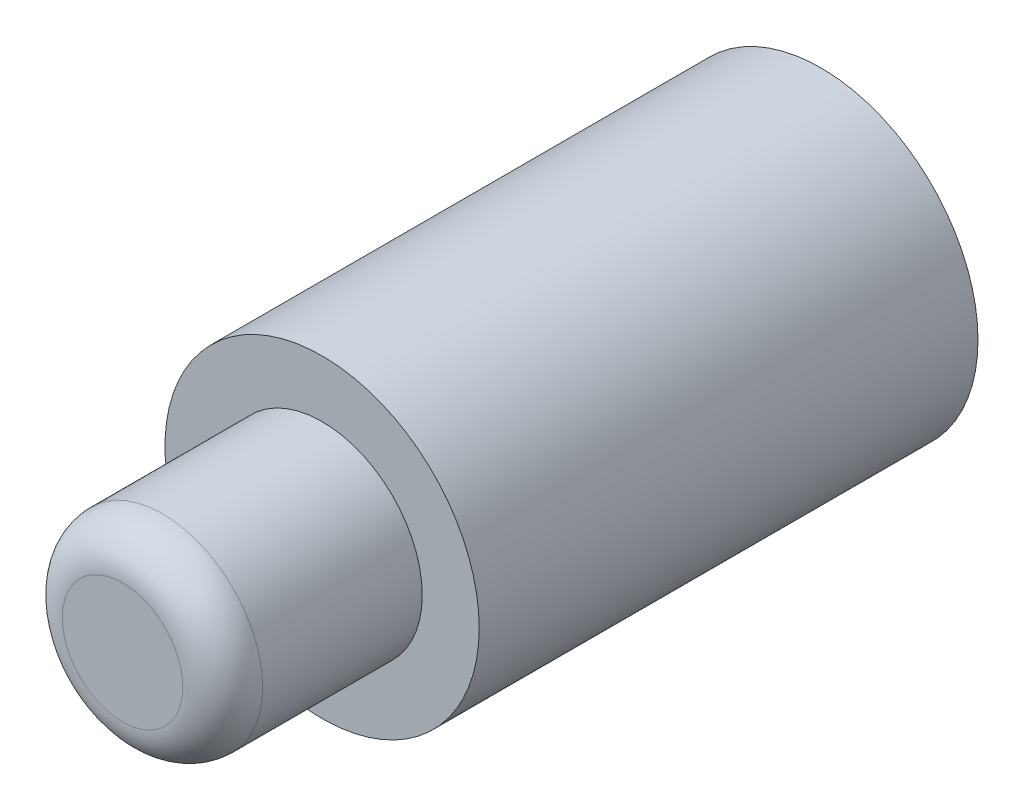
ISO-10303-21;
HEADER;
FILE_DESCRIPTION(('STEP AP214'),'2;1');
FILE_NAME('part.step','',(''),(''),'','','');
FILE_SCHEMA(('AUTOMOTIVE_DESIGN { 1 0 10303 214 1 1 1 1 }'));
ENDSEC;
DATA;
#1=APPLICATION_CONTEXT('core data for automotive mechanical design processes');
#2=APPLICATION_PROTOCOL_DEFINITION('international standard','automotive_design',2000,#1);
#3=PRODUCT_CONTEXT('',#1,'mechanical');
#4=PRODUCT('Part','Part','',(#3));
#5=PRODUCT_RELATED_PRODUCT_CATEGORY('part','',(#4));
#6=PRODUCT_DEFINITION_FORMATION('','',#4);
#7=PRODUCT_DEFINITION_CONTEXT('part definition',#1,'design');
#8=PRODUCT_DEFINITION('design','',#6,#7);
#9=PRODUCT_DEFINITION_SHAPE('','',#8);
#10=(LENGTH_UNIT() NAMED_UNIT(*) SI_UNIT(.MILLI.,.METRE.));
#11=(NAMED_UNIT(*) PLANE_ANGLE_UNIT() SI_UNIT($,.RADIAN.));
#12=(NAMED_UNIT(*) SI_UNIT($,.STERADIAN.) SOLID_ANGLE_UNIT());
#13=UNCERTAINTY_MEASURE_WITH_UNIT(LENGTH_MEASURE(1.E-05),#10,'distance_accuracy_value','');
#14=(GEOMETRIC_REPRESENTATION_CONTEXT(3) GLOBAL_UNCERTAINTY_ASSIGNED_CONTEXT((#13)) GLOBAL_UNIT_ASSIGNED_CONTEXT((#10,
#11,#12)) REPRESENTATION_CONTEXT('',''));
#15=CARTESIAN_POINT('',(0.,0.,0.));
#16=DIRECTION('',(0.,0.,1.));
#17=DIRECTION('',(1.,0.,0.));
#18=AXIS2_PLACEMENT_3D('',#15,#16,#17);
#19=CARTESIAN_POINT('',(0.,0.,8.89));
#20=DIRECTION('',(0.,0.,-1.));
#21=DIRECTION('',(-1.,0.,0.));
#22=AXIS2_PLACEMENT_3D('',#19,#20,#21);
#23=CYLINDRICAL_SURFACE('',#22,2.);
#24=CARTESIAN_POINT('',(0.,0.,0.));
#25=DIRECTION('',(0.,0.,1.));
#26=DIRECTION('',(1.,0.,0.));
#27=AXIS2_PLACEMENT_3D('',#24,#25,#26);
#28=CIRCLE('',#27,2.);
#29=CARTESIAN_POINT('',(2.,0.,0.));
#30=VERTEX_POINT('',#29);
#31=EDGE_CURVE('E44',#30,#30,#28,.T.);
#32=ORIENTED_EDGE('',*,*,#31,.T.);
#33=EDGE_LOOP('',(#32));
#34=FACE_BOUND('',#33,.T.);
#35=CARTESIAN_POINT('',(0.,0.,6.35));
#36=DIRECTION('',(0.,0.,1.));
#37=DIRECTION('',(1.,0.,0.));
#38=AXIS2_PLACEMENT_3D('',#35,#36,#37);
#39=CIRCLE('',#38,2.);
#40=CARTESIAN_POINT('',(2.,0.,6.35));
#41=VERTEX_POINT('',#40);
#42=EDGE_CURVE('E48',#41,#41,#39,.T.);
#43=ORIENTED_EDGE('',*,*,#42,.F.);
#44=EDGE_LOOP('',(#43));
#45=FACE_BOUND('',#44,.T.);
#46=ADVANCED_FACE('F33',(#34,#45),#23,.T.);
#47=CARTESIAN_POINT('',(0.,0.,0.));
#48=DIRECTION('',(0.,0.,1.));
#49=DIRECTION('',(1.,0.,0.));
#50=AXIS2_PLACEMENT_3D('',#47,#48,#49);
#51=PLANE('',#50);
#52=ORIENTED_EDGE('',*,*,#31,.F.);
#53=EDGE_LOOP('',(#52));
#54=FACE_BOUND('',#53,.T.);
#55=ADVANCED_FACE('F67',(#54),#51,.F.);
#56=CARTESIAN_POINT('',(0.,0.,6.35));
#57=DIRECTION('',(0.,0.,1.));
#58=DIRECTION('',(1.,0.,0.));
#59=AXIS2_PLACEMENT_3D('',#56,#57,#58);
#60=CYLINDRICAL_SURFACE('',#59,1.275);
#61=CARTESIAN_POINT('',(0.,0.,8.382));
#62=DIRECTION('',(0.,0.,1.));
#63=DIRECTION('',(1.,0.,0.));
#64=AXIS2_PLACEMENT_3D('',#61,#62,#63);
#65=CIRCLE('',#64,1.275);
#66=CARTESIAN_POINT('',(1.275,0.,8.382));
#67=VERTEX_POINT('',#66);
#68=EDGE_CURVE('E10',#67,#67,#65,.F.);
#69=ORIENTED_EDGE('',*,*,#68,.T.);
#70=EDGE_LOOP('',(#69));
#71=FACE_BOUND('',#70,.T.);
#72=CARTESIAN_POINT('',(0.,0.,6.35));
#73=DIRECTION('',(0.,0.,1.));
#74=DIRECTION('',(1.,0.,0.));
#75=AXIS2_PLACEMENT_3D('',#72,#73,#74);
#76=CIRCLE('',#75,1.275);
#77=CARTESIAN_POINT('',(1.275,0.,6.35));
#78=VERTEX_POINT('',#77);
#79=EDGE_CURVE('E53',#78,#78,#76,.T.);
#80=ORIENTED_EDGE('',*,*,#79,.T.);
#81=EDGE_LOOP('',(#80));
#82=FACE_BOUND('',#81,.T.);
#83=ADVANCED_FACE('F57',(#71,#82),#60,.T.);
#84=CARTESIAN_POINT('',(0.,0.,6.35));
#85=DIRECTION('',(0.,0.,1.));
#86=DIRECTION('',(1.,0.,0.));
#87=AXIS2_PLACEMENT_3D('',#84,#85,#86);
#88=PLANE('',#87);
#89=ORIENTED_EDGE('',*,*,#79,.F.);
#90=EDGE_LOOP('',(#89));
#91=FACE_BOUND('',#90,.T.);
#92=ORIENTED_EDGE('',*,*,#42,.T.);
#93=EDGE_LOOP('',(#92));
#94=FACE_BOUND('',#93,.T.);
#95=ADVANCED_FACE('F59',(#91,#94),#88,.T.);
#96=CARTESIAN_POINT('',(0.,0.,8.89));
#97=DIRECTION('',(0.,0.,1.));
#98=DIRECTION('',(1.,0.,0.));
#99=AXIS2_PLACEMENT_3D('',#96,#97,#98);
#100=PLANE('',#99);
#101=CARTESIAN_POINT('',(0.,0.,8.89));
#102=DIRECTION('',(0.,0.,1.));
#103=DIRECTION('',(1.,0.,0.));
#104=AXIS2_PLACEMENT_3D('',#101,#102,#103);
#105=CIRCLE('',#104,0.767);
#106=CARTESIAN_POINT('',(0.767,0.,8.89));
#107=VERTEX_POINT('',#106);
#108=EDGE_CURVE('E40',#107,#107,#105,.T.);
#109=ORIENTED_EDGE('',*,*,#108,.T.);
#110=EDGE_LOOP('',(#109));
#111=FACE_BOUND('',#110,.T.);
#112=ADVANCED_FACE('F62',(#111),#100,.T.);
#113=CARTESIAN_POINT('',(0.,0.,8.382));
#114=DIRECTION('',(0.,0.,1.));
#115=DIRECTION('',(1.,0.,0.));
#116=AXIS2_PLACEMENT_3D('',#113,#114,#115);
#117=TOROIDAL_SURFACE('',#116,0.767,0.508);
#118=ORIENTED_EDGE('',*,*,#68,.F.);
#119=EDGE_LOOP('',(#118));
#120=FACE_BOUND('',#119,.T.);
#121=ORIENTED_EDGE('',*,*,#108,.F.);
#122=EDGE_LOOP('',(#121));
#123=FACE_BOUND('',#122,.T.);
#124=ADVANCED_FACE('F35',(#120,#123),#117,.T.);
#125=CLOSED_SHELL('',(#46,#55,#83,#95,#112,#124));
#126=MANIFOLD_SOLID_BREP('B2',#125);
#127=ADVANCED_BREP_SHAPE_REPRESENTATION('',(#18,#126),#14);
#128=SHAPE_DEFINITION_REPRESENTATION(#9,#127);
ENDSEC;
END-ISO-10303-21;
